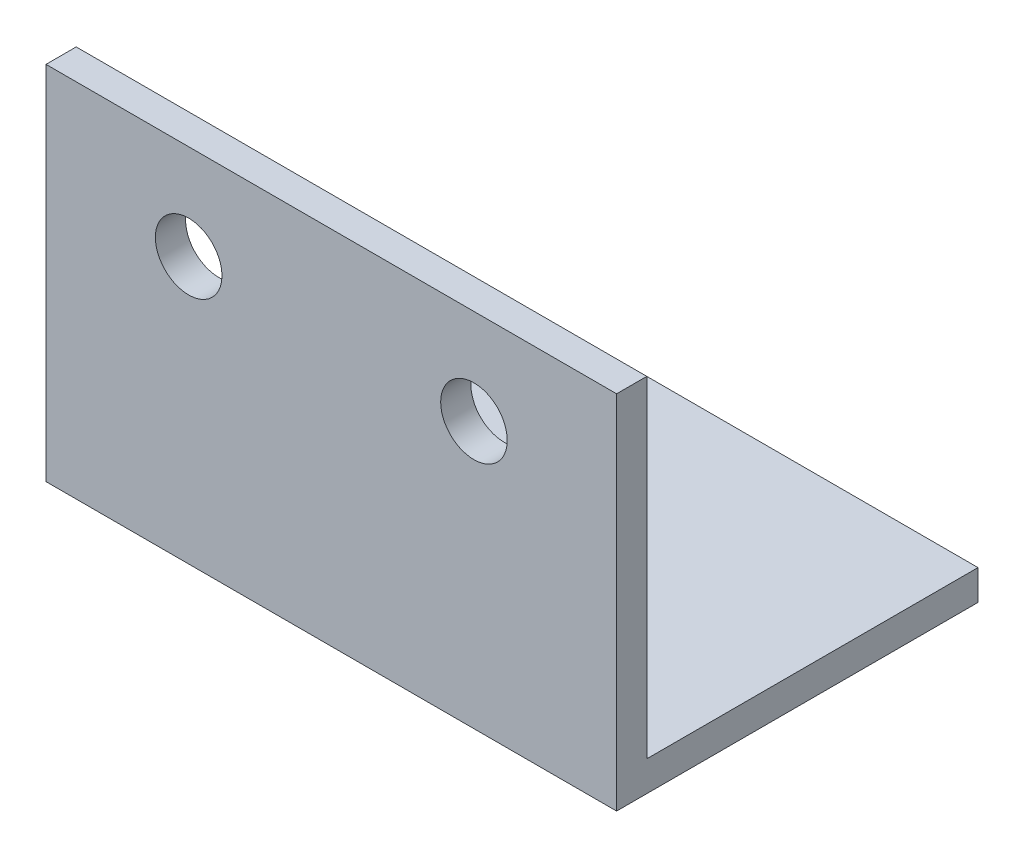
ISO-10303-21;
HEADER;
FILE_DESCRIPTION(('STEP AP214'),'2;1');
FILE_NAME('part.step','',(''),(''),'','','');
FILE_SCHEMA(('AUTOMOTIVE_DESIGN { 1 0 10303 214 1 1 1 1 }'));
ENDSEC;
DATA;
#1=APPLICATION_CONTEXT('core data for automotive mechanical design processes');
#2=APPLICATION_PROTOCOL_DEFINITION('international standard','automotive_design',2000,#1);
#3=PRODUCT_CONTEXT('',#1,'mechanical');
#4=PRODUCT('Part','Part','',(#3));
#5=PRODUCT_RELATED_PRODUCT_CATEGORY('part','',(#4));
#6=PRODUCT_DEFINITION_FORMATION('','',#4);
#7=PRODUCT_DEFINITION_CONTEXT('part definition',#1,'design');
#8=PRODUCT_DEFINITION('design','',#6,#7);
#9=PRODUCT_DEFINITION_SHAPE('','',#8);
#10=(LENGTH_UNIT() NAMED_UNIT(*) SI_UNIT(.MILLI.,.METRE.));
#11=(NAMED_UNIT(*) PLANE_ANGLE_UNIT() SI_UNIT($,.RADIAN.));
#12=(NAMED_UNIT(*) SI_UNIT($,.STERADIAN.) SOLID_ANGLE_UNIT());
#13=UNCERTAINTY_MEASURE_WITH_UNIT(LENGTH_MEASURE(1.E-05),#10,'distance_accuracy_value','');
#14=(GEOMETRIC_REPRESENTATION_CONTEXT(3) GLOBAL_UNCERTAINTY_ASSIGNED_CONTEXT((#13)) GLOBAL_UNIT_ASSIGNED_CONTEXT((#10,
#11,#12)) REPRESENTATION_CONTEXT('',''));
#15=CARTESIAN_POINT('',(0.,0.,0.));
#16=DIRECTION('',(0.,0.,1.));
#17=DIRECTION('',(1.,0.,0.));
#18=AXIS2_PLACEMENT_3D('',#15,#16,#17);
#19=CARTESIAN_POINT('',(30.,3.175,-34.825));
#20=DIRECTION('',(0.,-1.,0.));
#21=DIRECTION('',(1.,0.,0.));
#22=AXIS2_PLACEMENT_3D('',#19,#20,#21);
#23=PLANE('',#22);
#24=CARTESIAN_POINT('',(0.,3.175,-24.825));
#25=DIRECTION('',(0.,1.,0.));
#26=DIRECTION('',(-1.,0.,0.));
#27=AXIS2_PLACEMENT_3D('',#24,#25,#26);
#28=CIRCLE('',#27,3.5);
#29=CARTESIAN_POINT('',(-3.5,3.175,-24.825));
#30=VERTEX_POINT('',#29);
#31=EDGE_CURVE('E179',#30,#30,#28,.T.);
#32=ORIENTED_EDGE('',*,*,#31,.F.);
#33=EDGE_LOOP('',(#32));
#34=FACE_BOUND('',#33,.T.);
#35=DIRECTION('',(0.,0.,1.));
#36=VECTOR('',#35,1.);
#37=CARTESIAN_POINT('',(30.,3.175,-34.825));
#38=LINE('',#37,#36);
#39=CARTESIAN_POINT('',(30.,3.175,-34.825));
#40=VERTEX_POINT('',#39);
#41=CARTESIAN_POINT('',(30.,3.175,0.));
#42=VERTEX_POINT('',#41);
#43=EDGE_CURVE('E125',#40,#42,#38,.T.);
#44=ORIENTED_EDGE('',*,*,#43,.F.);
#45=DIRECTION('',(1.,0.,0.));
#46=VECTOR('',#45,1.);
#47=CARTESIAN_POINT('',(30.,3.175,-34.825));
#48=LINE('',#47,#46);
#49=CARTESIAN_POINT('',(-30.,3.175,-34.825));
#50=VERTEX_POINT('',#49);
#51=EDGE_CURVE('E84',#50,#40,#48,.T.);
#52=ORIENTED_EDGE('',*,*,#51,.F.);
#53=DIRECTION('',(0.,0.,-1.));
#54=VECTOR('',#53,1.);
#55=CARTESIAN_POINT('',(-30.,3.175,-34.825));
#56=LINE('',#55,#54);
#57=CARTESIAN_POINT('',(-30.,3.175,0.));
#58=VERTEX_POINT('',#57);
#59=EDGE_CURVE('E146',#58,#50,#56,.T.);
#60=ORIENTED_EDGE('',*,*,#59,.F.);
#61=DIRECTION('',(1.,0.,0.));
#62=VECTOR('',#61,1.);
#63=CARTESIAN_POINT('',(30.,3.175,0.));
#64=LINE('',#63,#62);
#65=EDGE_CURVE('E57',#58,#42,#64,.T.);
#66=ORIENTED_EDGE('',*,*,#65,.T.);
#67=EDGE_LOOP('',(#44,#52,#60,#66));
#68=FACE_BOUND('',#67,.T.);
#69=ADVANCED_FACE('F39',(#34,#68),#23,.F.);
#70=CARTESIAN_POINT('',(0.,0.,3.175));
#71=DIRECTION('',(0.,1.,0.));
#72=DIRECTION('',(0.,0.,1.));
#73=AXIS2_PLACEMENT_3D('',#70,#71,#72);
#74=PLANE('',#73);
#75=CARTESIAN_POINT('',(0.,0.,-24.825));
#76=DIRECTION('',(0.,1.,0.));
#77=DIRECTION('',(0.,0.,1.));
#78=AXIS2_PLACEMENT_3D('',#75,#76,#77);
#79=CIRCLE('',#78,3.5);
#80=CARTESIAN_POINT('',(0.,0.,-21.325));
#81=VERTEX_POINT('',#80);
#82=EDGE_CURVE('E43',#81,#81,#79,.T.);
#83=ORIENTED_EDGE('',*,*,#82,.T.);
#84=EDGE_LOOP('',(#83));
#85=FACE_BOUND('',#84,.T.);
#86=DIRECTION('',(1.,0.,0.));
#87=VECTOR('',#86,1.);
#88=CARTESIAN_POINT('',(0.,0.,3.175));
#89=LINE('',#88,#87);
#90=CARTESIAN_POINT('',(-30.,0.,3.175));
#91=VERTEX_POINT('',#90);
#92=CARTESIAN_POINT('',(30.,0.,3.175));
#93=VERTEX_POINT('',#92);
#94=EDGE_CURVE('E129',#91,#93,#89,.T.);
#95=ORIENTED_EDGE('',*,*,#94,.F.);
#96=DIRECTION('',(0.,0.,1.));
#97=VECTOR('',#96,1.);
#98=CARTESIAN_POINT('',(-30.,0.,-34.825));
#99=LINE('',#98,#97);
#100=CARTESIAN_POINT('',(-30.,0.,-34.825));
#101=VERTEX_POINT('',#100);
#102=EDGE_CURVE('E111',#101,#91,#99,.T.);
#103=ORIENTED_EDGE('',*,*,#102,.F.);
#104=DIRECTION('',(-1.,0.,0.));
#105=VECTOR('',#104,1.);
#106=CARTESIAN_POINT('',(30.,0.,-34.825));
#107=LINE('',#106,#105);
#108=CARTESIAN_POINT('',(30.,0.,-34.825));
#109=VERTEX_POINT('',#108);
#110=EDGE_CURVE('E110',#109,#101,#107,.T.);
#111=ORIENTED_EDGE('',*,*,#110,.F.);
#112=DIRECTION('',(0.,0.,-1.));
#113=VECTOR('',#112,1.);
#114=CARTESIAN_POINT('',(30.,0.,3.175));
#115=LINE('',#114,#113);
#116=EDGE_CURVE('E11',#93,#109,#115,.T.);
#117=ORIENTED_EDGE('',*,*,#116,.F.);
#118=EDGE_LOOP('',(#95,#103,#111,#117));
#119=FACE_BOUND('',#118,.T.);
#120=ADVANCED_FACE('F41',(#85,#119),#74,.F.);
#121=CARTESIAN_POINT('',(30.,0.,3.175));
#122=DIRECTION('',(-1.,0.,0.));
#123=DIRECTION('',(0.,0.,1.));
#124=AXIS2_PLACEMENT_3D('',#121,#122,#123);
#125=PLANE('',#124);
#126=ORIENTED_EDGE('',*,*,#116,.T.);
#127=DIRECTION('',(0.,-1.,0.));
#128=VECTOR('',#127,1.);
#129=CARTESIAN_POINT('',(30.,0.,-34.825));
#130=LINE('',#129,#128);
#131=EDGE_CURVE('E106',#40,#109,#130,.T.);
#132=ORIENTED_EDGE('',*,*,#131,.F.);
#133=ORIENTED_EDGE('',*,*,#43,.T.);
#134=DIRECTION('',(0.,1.,0.));
#135=VECTOR('',#134,1.);
#136=CARTESIAN_POINT('',(30.,0.,0.));
#137=LINE('',#136,#135);
#138=CARTESIAN_POINT('',(30.,38.,0.));
#139=VERTEX_POINT('',#138);
#140=EDGE_CURVE('E75',#42,#139,#137,.T.);
#141=ORIENTED_EDGE('',*,*,#140,.T.);
#142=DIRECTION('',(0.,0.,-1.));
#143=VECTOR('',#142,1.);
#144=CARTESIAN_POINT('',(30.,38.,3.175));
#145=LINE('',#144,#143);
#146=CARTESIAN_POINT('',(30.,38.,3.175));
#147=VERTEX_POINT('',#146);
#148=EDGE_CURVE('E49',#147,#139,#145,.T.);
#149=ORIENTED_EDGE('',*,*,#148,.F.);
#150=DIRECTION('',(0.,1.,0.));
#151=VECTOR('',#150,1.);
#152=CARTESIAN_POINT('',(30.,0.,3.175));
#153=LINE('',#152,#151);
#154=EDGE_CURVE('E66',#93,#147,#153,.T.);
#155=ORIENTED_EDGE('',*,*,#154,.F.);
#156=EDGE_LOOP('',(#126,#132,#133,#141,#149,#155));
#157=FACE_BOUND('',#156,.T.);
#158=ADVANCED_FACE('F105',(#157),#125,.F.);
#159=CARTESIAN_POINT('',(0.,38.,3.175));
#160=DIRECTION('',(0.,-1.,0.));
#161=DIRECTION('',(0.,0.,-1.));
#162=AXIS2_PLACEMENT_3D('',#159,#160,#161);
#163=PLANE('',#162);
#164=DIRECTION('',(-1.,0.,0.));
#165=VECTOR('',#164,1.);
#166=CARTESIAN_POINT('',(0.,38.,0.));
#167=LINE('',#166,#165);
#168=CARTESIAN_POINT('',(-30.,38.,0.));
#169=VERTEX_POINT('',#168);
#170=EDGE_CURVE('E132',#139,#169,#167,.T.);
#171=ORIENTED_EDGE('',*,*,#170,.T.);
#172=DIRECTION('',(0.,0.,-1.));
#173=VECTOR('',#172,1.);
#174=CARTESIAN_POINT('',(-30.,38.,3.175));
#175=LINE('',#174,#173);
#176=CARTESIAN_POINT('',(-30.,38.,3.175));
#177=VERTEX_POINT('',#176);
#178=EDGE_CURVE('E167',#177,#169,#175,.T.);
#179=ORIENTED_EDGE('',*,*,#178,.F.);
#180=DIRECTION('',(-1.,0.,0.));
#181=VECTOR('',#180,1.);
#182=CARTESIAN_POINT('',(0.,38.,3.175));
#183=LINE('',#182,#181);
#184=EDGE_CURVE('E135',#147,#177,#183,.T.);
#185=ORIENTED_EDGE('',*,*,#184,.F.);
#186=ORIENTED_EDGE('',*,*,#148,.T.);
#187=EDGE_LOOP('',(#171,#179,#185,#186));
#188=FACE_BOUND('',#187,.T.);
#189=ADVANCED_FACE('F214',(#188),#163,.F.);
#190=CARTESIAN_POINT('',(0.,0.,3.175));
#191=DIRECTION('',(0.,0.,-1.));
#192=DIRECTION('',(-1.,0.,0.));
#193=AXIS2_PLACEMENT_3D('',#190,#191,#192);
#194=PLANE('',#193);
#195=CARTESIAN_POINT('',(-15.,28.,3.175));
#196=DIRECTION('',(0.,0.,-1.));
#197=DIRECTION('',(-1.,0.,0.));
#198=AXIS2_PLACEMENT_3D('',#195,#196,#197);
#199=CIRCLE('',#198,3.5);
#200=CARTESIAN_POINT('',(-18.5,28.,3.175));
#201=VERTEX_POINT('',#200);
#202=EDGE_CURVE('E171',#201,#201,#199,.T.);
#203=ORIENTED_EDGE('',*,*,#202,.T.);
#204=EDGE_LOOP('',(#203));
#205=FACE_BOUND('',#204,.T.);
#206=ORIENTED_EDGE('',*,*,#154,.T.);
#207=ORIENTED_EDGE('',*,*,#184,.T.);
#208=DIRECTION('',(0.,1.,0.));
#209=VECTOR('',#208,1.);
#210=CARTESIAN_POINT('',(-30.,3.175,3.175));
#211=LINE('',#210,#209);
#212=EDGE_CURVE('E152',#91,#177,#211,.T.);
#213=ORIENTED_EDGE('',*,*,#212,.F.);
#214=ORIENTED_EDGE('',*,*,#94,.T.);
#215=EDGE_LOOP('',(#206,#207,#213,#214));
#216=FACE_BOUND('',#215,.T.);
#217=CARTESIAN_POINT('',(15.,28.,3.175));
#218=DIRECTION('',(0.,0.,-1.));
#219=DIRECTION('',(-1.,0.,0.));
#220=AXIS2_PLACEMENT_3D('',#217,#218,#219);
#221=CIRCLE('',#220,3.5);
#222=CARTESIAN_POINT('',(11.5,28.,3.175));
#223=VERTEX_POINT('',#222);
#224=EDGE_CURVE('E143',#223,#223,#221,.F.);
#225=ORIENTED_EDGE('',*,*,#224,.F.);
#226=EDGE_LOOP('',(#225));
#227=FACE_BOUND('',#226,.T.);
#228=ADVANCED_FACE('F210',(#205,#216,#227),#194,.F.);
#229=CARTESIAN_POINT('',(0.,0.,0.));
#230=DIRECTION('',(0.,0.,-1.));
#231=DIRECTION('',(-1.,0.,0.));
#232=AXIS2_PLACEMENT_3D('',#229,#230,#231);
#233=PLANE('',#232);
#234=CARTESIAN_POINT('',(-15.,28.,0.));
#235=DIRECTION('',(0.,0.,-1.));
#236=DIRECTION('',(-1.,0.,0.));
#237=AXIS2_PLACEMENT_3D('',#234,#235,#236);
#238=CIRCLE('',#237,3.5);
#239=CARTESIAN_POINT('',(-18.5,28.,0.));
#240=VERTEX_POINT('',#239);
#241=EDGE_CURVE('E175',#240,#240,#238,.T.);
#242=ORIENTED_EDGE('',*,*,#241,.F.);
#243=EDGE_LOOP('',(#242));
#244=FACE_BOUND('',#243,.T.);
#245=ORIENTED_EDGE('',*,*,#65,.F.);
#246=DIRECTION('',(0.,-1.,0.));
#247=VECTOR('',#246,1.);
#248=CARTESIAN_POINT('',(-30.,38.,0.));
#249=LINE('',#248,#247);
#250=EDGE_CURVE('E164',#169,#58,#249,.T.);
#251=ORIENTED_EDGE('',*,*,#250,.F.);
#252=ORIENTED_EDGE('',*,*,#170,.F.);
#253=ORIENTED_EDGE('',*,*,#140,.F.);
#254=EDGE_LOOP('',(#245,#251,#252,#253));
#255=FACE_BOUND('',#254,.T.);
#256=CARTESIAN_POINT('',(15.,28.,0.));
#257=DIRECTION('',(0.,0.,-1.));
#258=DIRECTION('',(-1.,0.,0.));
#259=AXIS2_PLACEMENT_3D('',#256,#257,#258);
#260=CIRCLE('',#259,3.5);
#261=CARTESIAN_POINT('',(11.5,28.,0.));
#262=VERTEX_POINT('',#261);
#263=EDGE_CURVE('E119',#262,#262,#260,.T.);
#264=ORIENTED_EDGE('',*,*,#263,.F.);
#265=EDGE_LOOP('',(#264));
#266=FACE_BOUND('',#265,.T.);
#267=ADVANCED_FACE('F213',(#244,#255,#266),#233,.T.);
#268=CARTESIAN_POINT('',(0.,0.,-34.825));
#269=DIRECTION('',(0.,0.,1.));
#270=DIRECTION('',(1.,0.,0.));
#271=AXIS2_PLACEMENT_3D('',#268,#269,#270);
#272=PLANE('',#271);
#273=ORIENTED_EDGE('',*,*,#131,.T.);
#274=ORIENTED_EDGE('',*,*,#110,.T.);
#275=DIRECTION('',(0.,-1.,0.));
#276=VECTOR('',#275,1.);
#277=CARTESIAN_POINT('',(-30.,3.175,-34.825));
#278=LINE('',#277,#276);
#279=EDGE_CURVE('E161',#50,#101,#278,.T.);
#280=ORIENTED_EDGE('',*,*,#279,.F.);
#281=ORIENTED_EDGE('',*,*,#51,.T.);
#282=EDGE_LOOP('',(#273,#274,#280,#281));
#283=FACE_BOUND('',#282,.T.);
#284=ADVANCED_FACE('F115',(#283),#272,.F.);
#285=CARTESIAN_POINT('',(15.,28.,5.));
#286=DIRECTION('',(0.,0.,-1.));
#287=DIRECTION('',(-1.,0.,0.));
#288=AXIS2_PLACEMENT_3D('',#285,#286,#287);
#289=CYLINDRICAL_SURFACE('',#288,3.5);
#290=ORIENTED_EDGE('',*,*,#224,.T.);
#291=EDGE_LOOP('',(#290));
#292=FACE_BOUND('',#291,.T.);
#293=ORIENTED_EDGE('',*,*,#263,.T.);
#294=EDGE_LOOP('',(#293));
#295=FACE_BOUND('',#294,.T.);
#296=ADVANCED_FACE('F246',(#292,#295),#289,.F.);
#297=CARTESIAN_POINT('',(-30.,0.,0.));
#298=DIRECTION('',(-1.,0.,0.));
#299=DIRECTION('',(0.,0.,1.));
#300=AXIS2_PLACEMENT_3D('',#297,#298,#299);
#301=PLANE('',#300);
#302=ORIENTED_EDGE('',*,*,#279,.T.);
#303=ORIENTED_EDGE('',*,*,#102,.T.);
#304=ORIENTED_EDGE('',*,*,#212,.T.);
#305=ORIENTED_EDGE('',*,*,#178,.T.);
#306=ORIENTED_EDGE('',*,*,#250,.T.);
#307=ORIENTED_EDGE('',*,*,#59,.T.);
#308=EDGE_LOOP('',(#302,#303,#304,#305,#306,#307));
#309=FACE_BOUND('',#308,.T.);
#310=ADVANCED_FACE('F196',(#309),#301,.T.);
#311=CARTESIAN_POINT('',(-15.,28.,30.));
#312=DIRECTION('',(0.,0.,-1.));
#313=DIRECTION('',(-1.,0.,0.));
#314=AXIS2_PLACEMENT_3D('',#311,#312,#313);
#315=CYLINDRICAL_SURFACE('',#314,3.5);
#316=ORIENTED_EDGE('',*,*,#241,.T.);
#317=EDGE_LOOP('',(#316));
#318=FACE_BOUND('',#317,.T.);
#319=ORIENTED_EDGE('',*,*,#202,.F.);
#320=EDGE_LOOP('',(#319));
#321=FACE_BOUND('',#320,.T.);
#322=ADVANCED_FACE('F191',(#318,#321),#315,.F.);
#323=CARTESIAN_POINT('',(0.,-61.825,-24.825));
#324=DIRECTION('',(0.,1.,0.));
#325=DIRECTION('',(-1.,0.,0.));
#326=AXIS2_PLACEMENT_3D('',#323,#324,#325);
#327=CYLINDRICAL_SURFACE('',#326,3.5);
#328=ORIENTED_EDGE('',*,*,#31,.T.);
#329=EDGE_LOOP('',(#328));
#330=FACE_BOUND('',#329,.T.);
#331=ORIENTED_EDGE('',*,*,#82,.F.);
#332=EDGE_LOOP('',(#331));
#333=FACE_BOUND('',#332,.T.);
#334=ADVANCED_FACE('F189',(#330,#333),#327,.F.);
#335=CLOSED_SHELL('',(#69,#120,#158,#189,#228,#267,#284,#296,#310,#322,#334));
#336=MANIFOLD_SOLID_BREP('B2',#335);
#337=ADVANCED_BREP_SHAPE_REPRESENTATION('',(#18,#336),#14);
#338=SHAPE_DEFINITION_REPRESENTATION(#9,#337);
ENDSEC;
END-ISO-10303-21;
